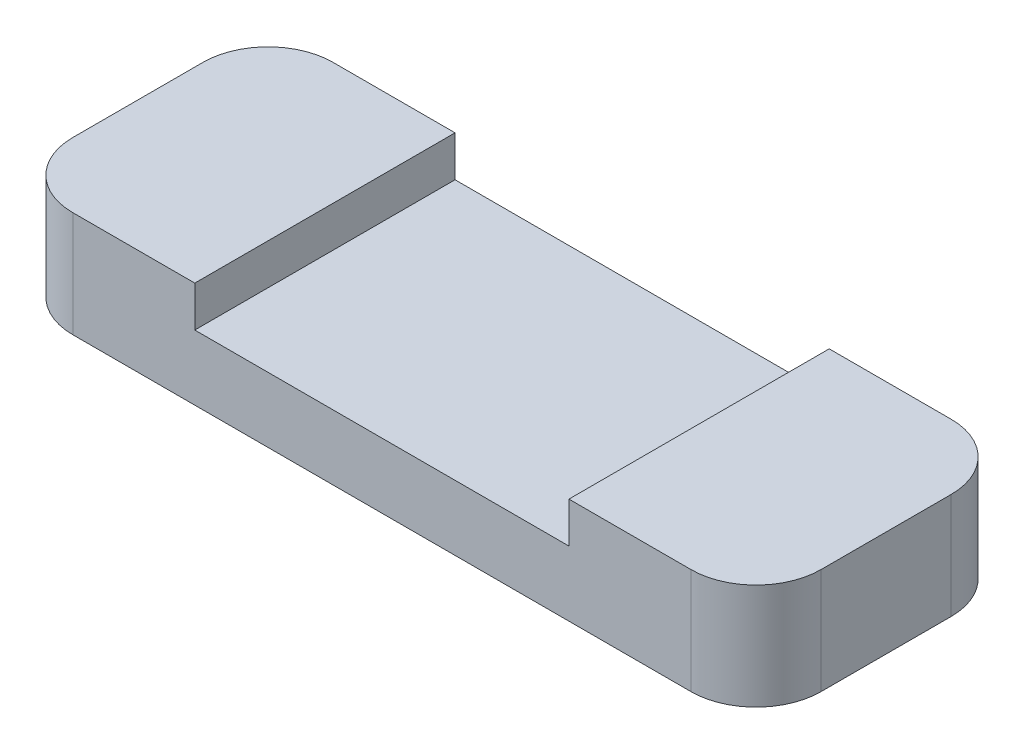
ISO-10303-21;
HEADER;
FILE_DESCRIPTION(('STEP AP214'),'2;1');
FILE_NAME('part.step','',(''),(''),'','','');
FILE_SCHEMA(('AUTOMOTIVE_DESIGN { 1 0 10303 214 1 1 1 1 }'));
ENDSEC;
DATA;
#1=APPLICATION_CONTEXT('core data for automotive mechanical design processes');
#2=APPLICATION_PROTOCOL_DEFINITION('international standard','automotive_design',2000,#1);
#3=PRODUCT_CONTEXT('',#1,'mechanical');
#4=PRODUCT('Part','Part','',(#3));
#5=PRODUCT_RELATED_PRODUCT_CATEGORY('part','',(#4));
#6=PRODUCT_DEFINITION_FORMATION('','',#4);
#7=PRODUCT_DEFINITION_CONTEXT('part definition',#1,'design');
#8=PRODUCT_DEFINITION('design','',#6,#7);
#9=PRODUCT_DEFINITION_SHAPE('','',#8);
#10=(LENGTH_UNIT() NAMED_UNIT(*) SI_UNIT(.MILLI.,.METRE.));
#11=(NAMED_UNIT(*) PLANE_ANGLE_UNIT() SI_UNIT($,.RADIAN.));
#12=(NAMED_UNIT(*) SI_UNIT($,.STERADIAN.) SOLID_ANGLE_UNIT());
#13=UNCERTAINTY_MEASURE_WITH_UNIT(LENGTH_MEASURE(1.E-05),#10,'distance_accuracy_value','');
#14=(GEOMETRIC_REPRESENTATION_CONTEXT(3) GLOBAL_UNCERTAINTY_ASSIGNED_CONTEXT((#13)) GLOBAL_UNIT_ASSIGNED_CONTEXT((#10,
#11,#12)) REPRESENTATION_CONTEXT('',''));
#15=CARTESIAN_POINT('',(0.,0.,0.));
#16=DIRECTION('',(0.,0.,1.));
#17=DIRECTION('',(1.,0.,0.));
#18=AXIS2_PLACEMENT_3D('',#15,#16,#17);
#19=CARTESIAN_POINT('',(19.,4.5,-4.));
#20=DIRECTION('',(0.,-1.,0.));
#21=DIRECTION('',(0.,0.,-1.));
#22=AXIS2_PLACEMENT_3D('',#19,#20,#21);
#23=PLANE('',#22);
#24=DIRECTION('',(-1.,0.,0.));
#25=VECTOR('',#24,1.);
#26=CARTESIAN_POINT('',(-19.,4.5,-8.));
#27=LINE('',#26,#25);
#28=CARTESIAN_POINT('',(19.,4.5,-8.));
#29=VERTEX_POINT('',#28);
#30=CARTESIAN_POINT('',(11.5,4.5,-8.));
#31=VERTEX_POINT('',#30);
#32=EDGE_CURVE('E230',#29,#31,#27,.T.);
#33=ORIENTED_EDGE('',*,*,#32,.T.);
#34=DIRECTION('',(0.,0.,1.));
#35=VECTOR('',#34,1.);
#36=CARTESIAN_POINT('',(11.5,4.5,-4.));
#37=LINE('',#36,#35);
#38=CARTESIAN_POINT('',(11.5,4.5,8.));
#39=VERTEX_POINT('',#38);
#40=EDGE_CURVE('E48',#31,#39,#37,.T.);
#41=ORIENTED_EDGE('',*,*,#40,.T.);
#42=DIRECTION('',(1.,0.,0.));
#43=VECTOR('',#42,1.);
#44=CARTESIAN_POINT('',(-19.,4.5,8.));
#45=LINE('',#44,#43);
#46=CARTESIAN_POINT('',(19.,4.5,8.));
#47=VERTEX_POINT('',#46);
#48=EDGE_CURVE('E155',#39,#47,#45,.T.);
#49=ORIENTED_EDGE('',*,*,#48,.T.);
#50=CARTESIAN_POINT('',(19.,4.5,4.));
#51=DIRECTION('',(0.,1.,0.));
#52=DIRECTION('',(0.,0.,-1.));
#53=AXIS2_PLACEMENT_3D('',#50,#51,#52);
#54=CIRCLE('',#53,4.);
#55=CARTESIAN_POINT('',(23.,4.5,3.99999999999997));
#56=VERTEX_POINT('',#55);
#57=EDGE_CURVE('E154',#47,#56,#54,.T.);
#58=ORIENTED_EDGE('',*,*,#57,.T.);
#59=DIRECTION('',(0.,0.,-1.));
#60=VECTOR('',#59,1.);
#61=CARTESIAN_POINT('',(23.,4.5,-3.99999999999997));
#62=LINE('',#61,#60);
#63=CARTESIAN_POINT('',(23.,4.5,-3.99999999999997));
#64=VERTEX_POINT('',#63);
#65=EDGE_CURVE('E160',#56,#64,#62,.T.);
#66=ORIENTED_EDGE('',*,*,#65,.T.);
#67=CARTESIAN_POINT('',(19.,4.5,-4.));
#68=DIRECTION('',(0.,1.,0.));
#69=DIRECTION('',(0.,0.,-1.));
#70=AXIS2_PLACEMENT_3D('',#67,#68,#69);
#71=CIRCLE('',#70,4.);
#72=EDGE_CURVE('E247',#64,#29,#71,.T.);
#73=ORIENTED_EDGE('',*,*,#72,.T.);
#74=EDGE_LOOP('',(#33,#41,#49,#58,#66,#73));
#75=FACE_BOUND('',#74,.T.);
#76=ADVANCED_FACE('F39',(#75),#23,.F.);
#77=CARTESIAN_POINT('',(19.,-2.,-4.));
#78=DIRECTION('',(0.,1.,0.));
#79=DIRECTION('',(0.,0.,1.));
#80=AXIS2_PLACEMENT_3D('',#77,#78,#79);
#81=CYLINDRICAL_SURFACE('',#80,4.);
#82=DIRECTION('',(0.,1.,0.));
#83=VECTOR('',#82,1.);
#84=CARTESIAN_POINT('',(19.,-2.,-8.));
#85=LINE('',#84,#83);
#86=CARTESIAN_POINT('',(19.,-2.,-8.));
#87=VERTEX_POINT('',#86);
#88=EDGE_CURVE('E199',#87,#29,#85,.T.);
#89=ORIENTED_EDGE('',*,*,#88,.T.);
#90=ORIENTED_EDGE('',*,*,#72,.F.);
#91=DIRECTION('',(0.,1.,0.));
#92=VECTOR('',#91,1.);
#93=CARTESIAN_POINT('',(23.,-2.,-3.99999999999997));
#94=LINE('',#93,#92);
#95=CARTESIAN_POINT('',(23.,-2.,-3.99999999999997));
#96=VERTEX_POINT('',#95);
#97=EDGE_CURVE('E63',#96,#64,#94,.T.);
#98=ORIENTED_EDGE('',*,*,#97,.F.);
#99=CARTESIAN_POINT('',(19.,-2.,-4.));
#100=DIRECTION('',(0.,1.,0.));
#101=DIRECTION('',(0.,0.,-1.));
#102=AXIS2_PLACEMENT_3D('',#99,#100,#101);
#103=CIRCLE('',#102,4.);
#104=EDGE_CURVE('E168',#96,#87,#103,.T.);
#105=ORIENTED_EDGE('',*,*,#104,.T.);
#106=EDGE_LOOP('',(#89,#90,#98,#105));
#107=FACE_BOUND('',#106,.T.);
#108=ADVANCED_FACE('F41',(#107),#81,.T.);
#109=CARTESIAN_POINT('',(23.,-2.,-3.99999999999997));
#110=DIRECTION('',(1.,0.,0.));
#111=DIRECTION('',(0.,0.,-1.));
#112=AXIS2_PLACEMENT_3D('',#109,#110,#111);
#113=PLANE('',#112);
#114=ORIENTED_EDGE('',*,*,#97,.T.);
#115=ORIENTED_EDGE('',*,*,#65,.F.);
#116=DIRECTION('',(0.,1.,0.));
#117=VECTOR('',#116,1.);
#118=CARTESIAN_POINT('',(23.,-2.,3.99999999999997));
#119=LINE('',#118,#117);
#120=CARTESIAN_POINT('',(23.,-2.,3.99999999999997));
#121=VERTEX_POINT('',#120);
#122=EDGE_CURVE('E202',#121,#56,#119,.T.);
#123=ORIENTED_EDGE('',*,*,#122,.F.);
#124=DIRECTION('',(0.,0.,-1.));
#125=VECTOR('',#124,1.);
#126=CARTESIAN_POINT('',(23.,-2.,-3.99999999999997));
#127=LINE('',#126,#125);
#128=EDGE_CURVE('E195',#121,#96,#127,.T.);
#129=ORIENTED_EDGE('',*,*,#128,.T.);
#130=EDGE_LOOP('',(#114,#115,#123,#129));
#131=FACE_BOUND('',#130,.T.);
#132=ADVANCED_FACE('F241',(#131),#113,.T.);
#133=CARTESIAN_POINT('',(19.,-2.,4.));
#134=DIRECTION('',(0.,1.,0.));
#135=DIRECTION('',(0.,0.,1.));
#136=AXIS2_PLACEMENT_3D('',#133,#134,#135);
#137=CYLINDRICAL_SURFACE('',#136,4.);
#138=ORIENTED_EDGE('',*,*,#122,.T.);
#139=ORIENTED_EDGE('',*,*,#57,.F.);
#140=DIRECTION('',(0.,1.,0.));
#141=VECTOR('',#140,1.);
#142=CARTESIAN_POINT('',(19.,-2.,8.));
#143=LINE('',#142,#141);
#144=CARTESIAN_POINT('',(19.,-2.,8.));
#145=VERTEX_POINT('',#144);
#146=EDGE_CURVE('E205',#145,#47,#143,.T.);
#147=ORIENTED_EDGE('',*,*,#146,.F.);
#148=CARTESIAN_POINT('',(19.,-2.,4.));
#149=DIRECTION('',(0.,1.,0.));
#150=DIRECTION('',(0.,0.,-1.));
#151=AXIS2_PLACEMENT_3D('',#148,#149,#150);
#152=CIRCLE('',#151,4.);
#153=EDGE_CURVE('E191',#145,#121,#152,.T.);
#154=ORIENTED_EDGE('',*,*,#153,.T.);
#155=EDGE_LOOP('',(#138,#139,#147,#154));
#156=FACE_BOUND('',#155,.T.);
#157=ADVANCED_FACE('F238',(#156),#137,.T.);
#158=CARTESIAN_POINT('',(-19.,-2.,8.));
#159=DIRECTION('',(0.,0.,1.));
#160=DIRECTION('',(1.,0.,0.));
#161=AXIS2_PLACEMENT_3D('',#158,#159,#160);
#162=PLANE('',#161);
#163=DIRECTION('',(0.,1.,0.));
#164=VECTOR('',#163,1.);
#165=CARTESIAN_POINT('',(11.5,-2.,8.));
#166=LINE('',#165,#164);
#167=CARTESIAN_POINT('',(11.5,2.,8.));
#168=VERTEX_POINT('',#167);
#169=EDGE_CURVE('E233',#168,#39,#166,.T.);
#170=ORIENTED_EDGE('',*,*,#169,.F.);
#171=DIRECTION('',(-1.,0.,0.));
#172=VECTOR('',#171,1.);
#173=CARTESIAN_POINT('',(-19.,2.,8.));
#174=LINE('',#173,#172);
#175=CARTESIAN_POINT('',(-11.5,2.,8.));
#176=VERTEX_POINT('',#175);
#177=EDGE_CURVE('E144',#168,#176,#174,.T.);
#178=ORIENTED_EDGE('',*,*,#177,.T.);
#179=DIRECTION('',(0.,-1.,0.));
#180=VECTOR('',#179,1.);
#181=CARTESIAN_POINT('',(-11.5,-2.,8.));
#182=LINE('',#181,#180);
#183=CARTESIAN_POINT('',(-11.5,4.5,8.));
#184=VERTEX_POINT('',#183);
#185=EDGE_CURVE('E131',#184,#176,#182,.T.);
#186=ORIENTED_EDGE('',*,*,#185,.F.);
#187=CARTESIAN_POINT('',(-19.,4.5,8.));
#188=VERTEX_POINT('',#187);
#189=EDGE_CURVE('E143',#188,#184,#45,.T.);
#190=ORIENTED_EDGE('',*,*,#189,.F.);
#191=DIRECTION('',(0.,1.,0.));
#192=VECTOR('',#191,1.);
#193=CARTESIAN_POINT('',(-19.,-2.,8.));
#194=LINE('',#193,#192);
#195=CARTESIAN_POINT('',(-19.,-2.,8.));
#196=VERTEX_POINT('',#195);
#197=EDGE_CURVE('E209',#196,#188,#194,.T.);
#198=ORIENTED_EDGE('',*,*,#197,.F.);
#199=DIRECTION('',(1.,0.,0.));
#200=VECTOR('',#199,1.);
#201=CARTESIAN_POINT('',(-19.,-2.,8.));
#202=LINE('',#201,#200);
#203=EDGE_CURVE('E187',#196,#145,#202,.T.);
#204=ORIENTED_EDGE('',*,*,#203,.T.);
#205=ORIENTED_EDGE('',*,*,#146,.T.);
#206=ORIENTED_EDGE('',*,*,#48,.F.);
#207=EDGE_LOOP('',(#170,#178,#186,#190,#198,#204,#205,#206));
#208=FACE_BOUND('',#207,.T.);
#209=ADVANCED_FACE('F142',(#208),#162,.T.);
#210=CARTESIAN_POINT('',(-19.,-2.,4.));
#211=DIRECTION('',(0.,1.,0.));
#212=DIRECTION('',(0.,0.,1.));
#213=AXIS2_PLACEMENT_3D('',#210,#211,#212);
#214=CYLINDRICAL_SURFACE('',#213,4.);
#215=ORIENTED_EDGE('',*,*,#197,.T.);
#216=CARTESIAN_POINT('',(-19.,4.5,4.));
#217=DIRECTION('',(0.,1.,0.));
#218=DIRECTION('',(0.,0.,1.));
#219=AXIS2_PLACEMENT_3D('',#216,#217,#218);
#220=CIRCLE('',#219,4.);
#221=CARTESIAN_POINT('',(-23.,4.5,3.99999999999997));
#222=VERTEX_POINT('',#221);
#223=EDGE_CURVE('E152',#222,#188,#220,.T.);
#224=ORIENTED_EDGE('',*,*,#223,.F.);
#225=DIRECTION('',(0.,1.,0.));
#226=VECTOR('',#225,1.);
#227=CARTESIAN_POINT('',(-23.,-2.,3.99999999999997));
#228=LINE('',#227,#226);
#229=CARTESIAN_POINT('',(-23.,-2.,3.99999999999997));
#230=VERTEX_POINT('',#229);
#231=EDGE_CURVE('E212',#230,#222,#228,.T.);
#232=ORIENTED_EDGE('',*,*,#231,.F.);
#233=CARTESIAN_POINT('',(-19.,-2.,4.));
#234=DIRECTION('',(0.,1.,0.));
#235=DIRECTION('',(0.,0.,1.));
#236=AXIS2_PLACEMENT_3D('',#233,#234,#235);
#237=CIRCLE('',#236,4.);
#238=EDGE_CURVE('E183',#230,#196,#237,.T.);
#239=ORIENTED_EDGE('',*,*,#238,.T.);
#240=EDGE_LOOP('',(#215,#224,#232,#239));
#241=FACE_BOUND('',#240,.T.);
#242=ADVANCED_FACE('F270',(#241),#214,.T.);
#243=CARTESIAN_POINT('',(-23.,-2.,-3.99999999999997));
#244=DIRECTION('',(-1.,0.,0.));
#245=DIRECTION('',(0.,0.,1.));
#246=AXIS2_PLACEMENT_3D('',#243,#244,#245);
#247=PLANE('',#246);
#248=ORIENTED_EDGE('',*,*,#231,.T.);
#249=DIRECTION('',(0.,0.,1.));
#250=VECTOR('',#249,1.);
#251=CARTESIAN_POINT('',(-23.,4.5,-3.99999999999997));
#252=LINE('',#251,#250);
#253=CARTESIAN_POINT('',(-23.,4.5,-3.99999999999997));
#254=VERTEX_POINT('',#253);
#255=EDGE_CURVE('E263',#254,#222,#252,.T.);
#256=ORIENTED_EDGE('',*,*,#255,.F.);
#257=DIRECTION('',(0.,1.,0.));
#258=VECTOR('',#257,1.);
#259=CARTESIAN_POINT('',(-23.,-2.,-3.99999999999997));
#260=LINE('',#259,#258);
#261=CARTESIAN_POINT('',(-23.,-2.,-3.99999999999997));
#262=VERTEX_POINT('',#261);
#263=EDGE_CURVE('E215',#262,#254,#260,.T.);
#264=ORIENTED_EDGE('',*,*,#263,.F.);
#265=DIRECTION('',(0.,0.,1.));
#266=VECTOR('',#265,1.);
#267=CARTESIAN_POINT('',(-23.,-2.,-3.99999999999997));
#268=LINE('',#267,#266);
#269=EDGE_CURVE('E179',#262,#230,#268,.T.);
#270=ORIENTED_EDGE('',*,*,#269,.T.);
#271=EDGE_LOOP('',(#248,#256,#264,#270));
#272=FACE_BOUND('',#271,.T.);
#273=ADVANCED_FACE('F273',(#272),#247,.T.);
#274=CARTESIAN_POINT('',(-19.,-2.,-4.));
#275=DIRECTION('',(0.,1.,0.));
#276=DIRECTION('',(0.,0.,1.));
#277=AXIS2_PLACEMENT_3D('',#274,#275,#276);
#278=CYLINDRICAL_SURFACE('',#277,4.);
#279=ORIENTED_EDGE('',*,*,#263,.T.);
#280=CARTESIAN_POINT('',(-19.,4.5,-4.));
#281=DIRECTION('',(0.,1.,0.));
#282=DIRECTION('',(0.,0.,1.));
#283=AXIS2_PLACEMENT_3D('',#280,#281,#282);
#284=CIRCLE('',#283,4.);
#285=CARTESIAN_POINT('',(-19.,4.5,-8.));
#286=VERTEX_POINT('',#285);
#287=EDGE_CURVE('E251',#286,#254,#284,.T.);
#288=ORIENTED_EDGE('',*,*,#287,.F.);
#289=DIRECTION('',(0.,1.,0.));
#290=VECTOR('',#289,1.);
#291=CARTESIAN_POINT('',(-19.,-2.,-8.));
#292=LINE('',#291,#290);
#293=CARTESIAN_POINT('',(-19.,-2.,-8.));
#294=VERTEX_POINT('',#293);
#295=EDGE_CURVE('E218',#294,#286,#292,.T.);
#296=ORIENTED_EDGE('',*,*,#295,.F.);
#297=CARTESIAN_POINT('',(-19.,-2.,-4.));
#298=DIRECTION('',(0.,1.,0.));
#299=DIRECTION('',(0.,0.,1.));
#300=AXIS2_PLACEMENT_3D('',#297,#298,#299);
#301=CIRCLE('',#300,4.);
#302=EDGE_CURVE('E175',#294,#262,#301,.T.);
#303=ORIENTED_EDGE('',*,*,#302,.T.);
#304=EDGE_LOOP('',(#279,#288,#296,#303));
#305=FACE_BOUND('',#304,.T.);
#306=ADVANCED_FACE('F275',(#305),#278,.T.);
#307=CARTESIAN_POINT('',(-19.,-2.,-8.));
#308=DIRECTION('',(0.,0.,-1.));
#309=DIRECTION('',(-1.,0.,0.));
#310=AXIS2_PLACEMENT_3D('',#307,#308,#309);
#311=PLANE('',#310);
#312=DIRECTION('',(0.,-1.,0.));
#313=VECTOR('',#312,1.);
#314=CARTESIAN_POINT('',(11.5,-2.,-8.));
#315=LINE('',#314,#313);
#316=CARTESIAN_POINT('',(11.5,2.,-8.));
#317=VERTEX_POINT('',#316);
#318=EDGE_CURVE('E146',#31,#317,#315,.T.);
#319=ORIENTED_EDGE('',*,*,#318,.F.);
#320=ORIENTED_EDGE('',*,*,#32,.F.);
#321=ORIENTED_EDGE('',*,*,#88,.F.);
#322=DIRECTION('',(-1.,0.,0.));
#323=VECTOR('',#322,1.);
#324=CARTESIAN_POINT('',(-19.,-2.,-8.));
#325=LINE('',#324,#323);
#326=EDGE_CURVE('E171',#87,#294,#325,.T.);
#327=ORIENTED_EDGE('',*,*,#326,.T.);
#328=ORIENTED_EDGE('',*,*,#295,.T.);
#329=CARTESIAN_POINT('',(-11.5,4.5,-8.));
#330=VERTEX_POINT('',#329);
#331=EDGE_CURVE('E252',#330,#286,#27,.T.);
#332=ORIENTED_EDGE('',*,*,#331,.F.);
#333=DIRECTION('',(0.,1.,0.));
#334=VECTOR('',#333,1.);
#335=CARTESIAN_POINT('',(-11.5,-2.,-8.));
#336=LINE('',#335,#334);
#337=CARTESIAN_POINT('',(-11.5,2.,-8.));
#338=VERTEX_POINT('',#337);
#339=EDGE_CURVE('E55',#338,#330,#336,.T.);
#340=ORIENTED_EDGE('',*,*,#339,.F.);
#341=DIRECTION('',(1.,0.,0.));
#342=VECTOR('',#341,1.);
#343=CARTESIAN_POINT('',(-19.,2.,-8.));
#344=LINE('',#343,#342);
#345=EDGE_CURVE('E11',#338,#317,#344,.T.);
#346=ORIENTED_EDGE('',*,*,#345,.T.);
#347=EDGE_LOOP('',(#319,#320,#321,#327,#328,#332,#340,#346));
#348=FACE_BOUND('',#347,.T.);
#349=ADVANCED_FACE('F249',(#348),#311,.T.);
#350=CARTESIAN_POINT('',(19.,-2.,-4.));
#351=DIRECTION('',(0.,-1.,0.));
#352=DIRECTION('',(0.,0.,-1.));
#353=AXIS2_PLACEMENT_3D('',#350,#351,#352);
#354=PLANE('',#353);
#355=ORIENTED_EDGE('',*,*,#104,.F.);
#356=ORIENTED_EDGE('',*,*,#128,.F.);
#357=ORIENTED_EDGE('',*,*,#153,.F.);
#358=ORIENTED_EDGE('',*,*,#203,.F.);
#359=ORIENTED_EDGE('',*,*,#238,.F.);
#360=ORIENTED_EDGE('',*,*,#269,.F.);
#361=ORIENTED_EDGE('',*,*,#302,.F.);
#362=ORIENTED_EDGE('',*,*,#326,.F.);
#363=EDGE_LOOP('',(#355,#356,#357,#358,#359,#360,#361,#362));
#364=FACE_BOUND('',#363,.T.);
#365=ADVANCED_FACE('F244',(#364),#354,.T.);
#366=ORIENTED_EDGE('',*,*,#189,.T.);
#367=DIRECTION('',(0.,0.,-1.));
#368=VECTOR('',#367,1.);
#369=CARTESIAN_POINT('',(-11.5,4.5,-4.));
#370=LINE('',#369,#368);
#371=EDGE_CURVE('E128',#184,#330,#370,.T.);
#372=ORIENTED_EDGE('',*,*,#371,.T.);
#373=ORIENTED_EDGE('',*,*,#331,.T.);
#374=ORIENTED_EDGE('',*,*,#287,.T.);
#375=ORIENTED_EDGE('',*,*,#255,.T.);
#376=ORIENTED_EDGE('',*,*,#223,.T.);
#377=EDGE_LOOP('',(#366,#372,#373,#374,#375,#376));
#378=FACE_BOUND('',#377,.T.);
#379=ADVANCED_FACE('F149',(#378),#23,.F.);
#380=CARTESIAN_POINT('',(11.5,2.,-10.1007531445024));
#381=DIRECTION('',(1.,0.,0.));
#382=DIRECTION('',(0.,0.,-1.));
#383=AXIS2_PLACEMENT_3D('',#380,#381,#382);
#384=PLANE('',#383);
#385=ORIENTED_EDGE('',*,*,#169,.T.);
#386=ORIENTED_EDGE('',*,*,#40,.F.);
#387=ORIENTED_EDGE('',*,*,#318,.T.);
#388=DIRECTION('',(0.,0.,-1.));
#389=VECTOR('',#388,1.);
#390=CARTESIAN_POINT('',(11.5,2.,-10.1007531445024));
#391=LINE('',#390,#389);
#392=EDGE_CURVE('E280',#168,#317,#391,.T.);
#393=ORIENTED_EDGE('',*,*,#392,.F.);
#394=EDGE_LOOP('',(#385,#386,#387,#393));
#395=FACE_BOUND('',#394,.T.);
#396=ADVANCED_FACE('F287',(#395),#384,.F.);
#397=CARTESIAN_POINT('',(-11.5,2.,-10.1007531445024));
#398=DIRECTION('',(-1.,0.,0.));
#399=DIRECTION('',(0.,0.,1.));
#400=AXIS2_PLACEMENT_3D('',#397,#398,#399);
#401=PLANE('',#400);
#402=ORIENTED_EDGE('',*,*,#185,.T.);
#403=DIRECTION('',(0.,0.,1.));
#404=VECTOR('',#403,1.);
#405=CARTESIAN_POINT('',(-11.5,2.,-10.1007531445024));
#406=LINE('',#405,#404);
#407=EDGE_CURVE('E277',#338,#176,#406,.T.);
#408=ORIENTED_EDGE('',*,*,#407,.F.);
#409=ORIENTED_EDGE('',*,*,#339,.T.);
#410=ORIENTED_EDGE('',*,*,#371,.F.);
#411=EDGE_LOOP('',(#402,#408,#409,#410));
#412=FACE_BOUND('',#411,.T.);
#413=ADVANCED_FACE('F130',(#412),#401,.F.);
#414=CARTESIAN_POINT('',(0.,2.,0.));
#415=DIRECTION('',(0.,1.,0.));
#416=DIRECTION('',(0.,0.,1.));
#417=AXIS2_PLACEMENT_3D('',#414,#415,#416);
#418=PLANE('',#417);
#419=ORIENTED_EDGE('',*,*,#392,.T.);
#420=ORIENTED_EDGE('',*,*,#345,.F.);
#421=ORIENTED_EDGE('',*,*,#407,.T.);
#422=ORIENTED_EDGE('',*,*,#177,.F.);
#423=EDGE_LOOP('',(#419,#420,#421,#422));
#424=FACE_BOUND('',#423,.T.);
#425=ADVANCED_FACE('F291',(#424),#418,.T.);
#426=CLOSED_SHELL('',(#76,#108,#132,#157,#209,#242,#273,#306,#349,#365,#379,#396,#413,#425));
#427=MANIFOLD_SOLID_BREP('B2',#426);
#428=ADVANCED_BREP_SHAPE_REPRESENTATION('',(#18,#427),#14);
#429=SHAPE_DEFINITION_REPRESENTATION(#9,#428);
ENDSEC;
END-ISO-10303-21;
